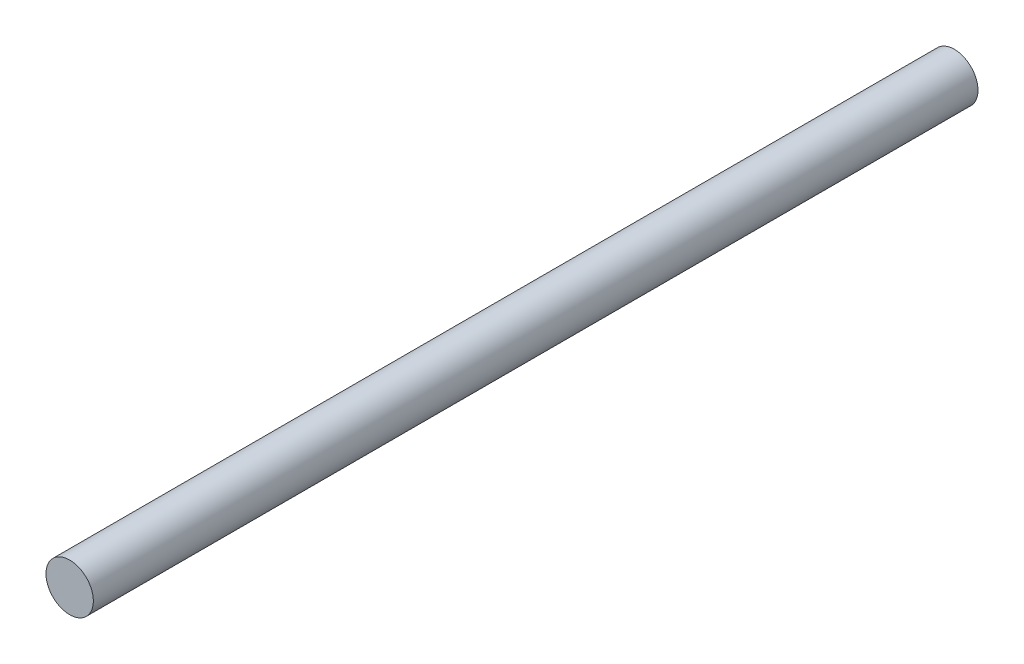
ISO-10303-21;
HEADER;
FILE_DESCRIPTION(('STEP AP214'),'2;1');
FILE_NAME('part.step','',(''),(''),'','','');
FILE_SCHEMA(('AUTOMOTIVE_DESIGN { 1 0 10303 214 1 1 1 1 }'));
ENDSEC;
DATA;
#1=APPLICATION_CONTEXT('core data for automotive mechanical design processes');
#2=APPLICATION_PROTOCOL_DEFINITION('international standard','automotive_design',2000,#1);
#3=PRODUCT_CONTEXT('',#1,'mechanical');
#4=PRODUCT('Part','Part','',(#3));
#5=PRODUCT_RELATED_PRODUCT_CATEGORY('part','',(#4));
#6=PRODUCT_DEFINITION_FORMATION('','',#4);
#7=PRODUCT_DEFINITION_CONTEXT('part definition',#1,'design');
#8=PRODUCT_DEFINITION('design','',#6,#7);
#9=PRODUCT_DEFINITION_SHAPE('','',#8);
#10=(LENGTH_UNIT() NAMED_UNIT(*) SI_UNIT(.MILLI.,.METRE.));
#11=(NAMED_UNIT(*) PLANE_ANGLE_UNIT() SI_UNIT($,.RADIAN.));
#12=(NAMED_UNIT(*) SI_UNIT($,.STERADIAN.) SOLID_ANGLE_UNIT());
#13=UNCERTAINTY_MEASURE_WITH_UNIT(LENGTH_MEASURE(1.E-05),#10,'distance_accuracy_value','');
#14=(GEOMETRIC_REPRESENTATION_CONTEXT(3) GLOBAL_UNCERTAINTY_ASSIGNED_CONTEXT((#13)) GLOBAL_UNIT_ASSIGNED_CONTEXT((#10,
#11,#12)) REPRESENTATION_CONTEXT('',''));
#15=CARTESIAN_POINT('',(0.,0.,0.));
#16=DIRECTION('',(0.,0.,1.));
#17=DIRECTION('',(1.,0.,0.));
#18=AXIS2_PLACEMENT_3D('',#15,#16,#17);
#19=CARTESIAN_POINT('',(0.,0.,560.));
#20=DIRECTION('',(0.,0.,-1.));
#21=DIRECTION('',(-1.,0.,0.));
#22=AXIS2_PLACEMENT_3D('',#19,#20,#21);
#23=CYLINDRICAL_SURFACE('',#22,15.);
#24=CARTESIAN_POINT('',(0.,0.,560.));
#25=DIRECTION('',(0.,0.,1.));
#26=DIRECTION('',(1.,0.,0.));
#27=AXIS2_PLACEMENT_3D('',#24,#25,#26);
#28=CIRCLE('',#27,15.);
#29=CARTESIAN_POINT('',(15.,0.,560.));
#30=VERTEX_POINT('',#29);
#31=EDGE_CURVE('E10',#30,#30,#28,.T.);
#32=ORIENTED_EDGE('',*,*,#31,.F.);
#33=EDGE_LOOP('',(#32));
#34=FACE_BOUND('',#33,.T.);
#35=CARTESIAN_POINT('',(0.,0.,0.));
#36=DIRECTION('',(0.,0.,1.));
#37=DIRECTION('',(1.,0.,0.));
#38=AXIS2_PLACEMENT_3D('',#35,#36,#37);
#39=CIRCLE('',#38,15.);
#40=CARTESIAN_POINT('',(15.,0.,0.));
#41=VERTEX_POINT('',#40);
#42=EDGE_CURVE('E50',#41,#41,#39,.T.);
#43=ORIENTED_EDGE('',*,*,#42,.T.);
#44=EDGE_LOOP('',(#43));
#45=FACE_BOUND('',#44,.T.);
#46=ADVANCED_FACE('F47',(#34,#45),#23,.T.);
#47=CARTESIAN_POINT('',(0.,0.,560.));
#48=DIRECTION('',(0.,0.,1.));
#49=DIRECTION('',(1.,0.,0.));
#50=AXIS2_PLACEMENT_3D('',#47,#48,#49);
#51=PLANE('',#50);
#52=ORIENTED_EDGE('',*,*,#31,.T.);
#53=EDGE_LOOP('',(#52));
#54=FACE_BOUND('',#53,.T.);
#55=ADVANCED_FACE('F64',(#54),#51,.T.);
#56=CARTESIAN_POINT('',(0.,0.,0.));
#57=DIRECTION('',(0.,0.,1.));
#58=DIRECTION('',(1.,0.,0.));
#59=AXIS2_PLACEMENT_3D('',#56,#57,#58);
#60=PLANE('',#59);
#61=ORIENTED_EDGE('',*,*,#42,.F.);
#62=EDGE_LOOP('',(#61));
#63=FACE_BOUND('',#62,.T.);
#64=ADVANCED_FACE('F62',(#63),#60,.F.);
#65=CLOSED_SHELL('',(#46,#55,#64));
#66=MANIFOLD_SOLID_BREP('B2',#65);
#67=ADVANCED_BREP_SHAPE_REPRESENTATION('',(#18,#66),#14);
#68=SHAPE_DEFINITION_REPRESENTATION(#9,#67);
ENDSEC;
END-ISO-10303-21;
